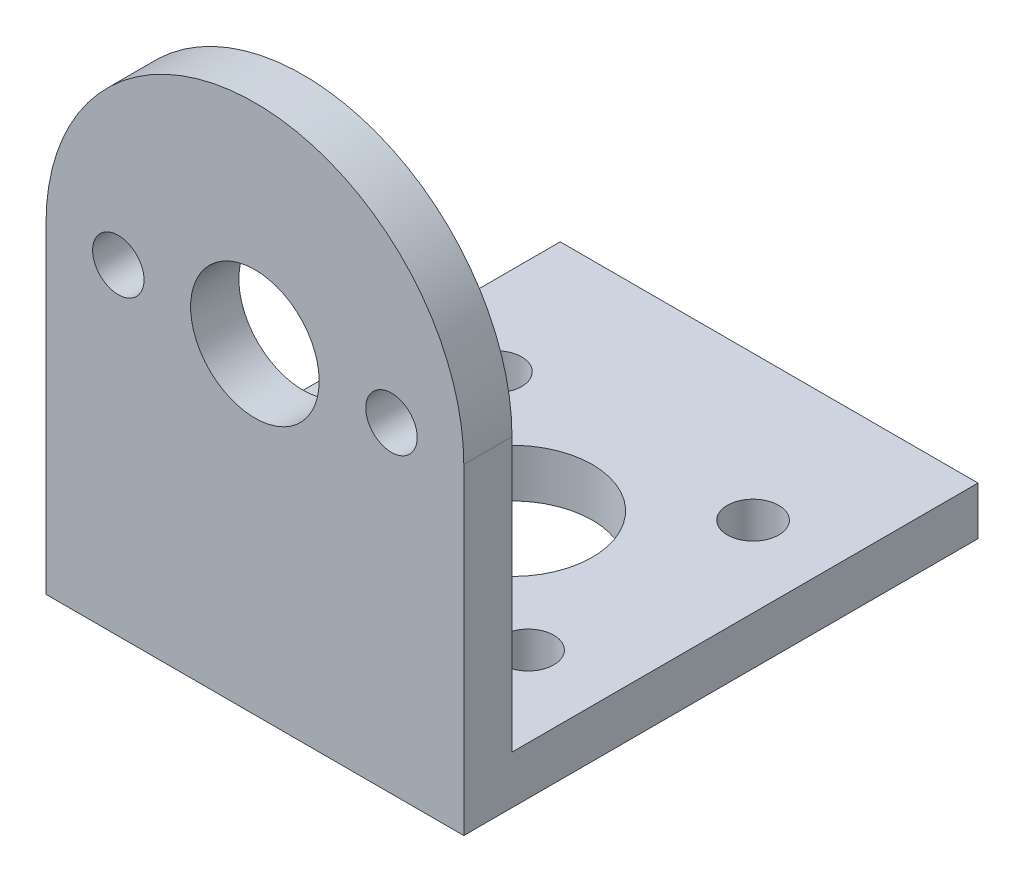
ISO-10303-21;
HEADER;
FILE_DESCRIPTION(('STEP AP214'),'2;1');
FILE_NAME('part.step','',(''),(''),'','','');
FILE_SCHEMA(('AUTOMOTIVE_DESIGN { 1 0 10303 214 1 1 1 1 }'));
ENDSEC;
DATA;
#1=APPLICATION_CONTEXT('core data for automotive mechanical design processes');
#2=APPLICATION_PROTOCOL_DEFINITION('international standard','automotive_design',2000,#1);
#3=PRODUCT_CONTEXT('',#1,'mechanical');
#4=PRODUCT('Part','Part','',(#3));
#5=PRODUCT_RELATED_PRODUCT_CATEGORY('part','',(#4));
#6=PRODUCT_DEFINITION_FORMATION('','',#4);
#7=PRODUCT_DEFINITION_CONTEXT('part definition',#1,'design');
#8=PRODUCT_DEFINITION('design','',#6,#7);
#9=PRODUCT_DEFINITION_SHAPE('','',#8);
#10=(LENGTH_UNIT() NAMED_UNIT(*) SI_UNIT(.MILLI.,.METRE.));
#11=(NAMED_UNIT(*) PLANE_ANGLE_UNIT() SI_UNIT($,.RADIAN.));
#12=(NAMED_UNIT(*) SI_UNIT($,.STERADIAN.) SOLID_ANGLE_UNIT());
#13=UNCERTAINTY_MEASURE_WITH_UNIT(LENGTH_MEASURE(1.E-05),#10,'distance_accuracy_value','');
#14=(GEOMETRIC_REPRESENTATION_CONTEXT(3) GLOBAL_UNCERTAINTY_ASSIGNED_CONTEXT((#13)) GLOBAL_UNIT_ASSIGNED_CONTEXT((#10,
#11,#12)) REPRESENTATION_CONTEXT('',''));
#15=CARTESIAN_POINT('',(0.,0.,0.));
#16=DIRECTION('',(0.,0.,1.));
#17=DIRECTION('',(1.,0.,0.));
#18=AXIS2_PLACEMENT_3D('',#15,#16,#17);
#19=CARTESIAN_POINT('',(0.,-20.,3.));
#20=DIRECTION('',(0.,1.,0.));
#21=DIRECTION('',(0.,0.,1.));
#22=AXIS2_PLACEMENT_3D('',#19,#20,#21);
#23=PLANE('',#22);
#24=CARTESIAN_POINT('',(13.,-20.,-13.));
#25=DIRECTION('',(0.,-1.,0.));
#26=DIRECTION('',(0.,0.,-1.));
#27=AXIS2_PLACEMENT_3D('',#24,#25,#26);
#28=CIRCLE('',#27,5.);
#29=CARTESIAN_POINT('',(13.,-20.,-18.));
#30=VERTEX_POINT('',#29);
#31=EDGE_CURVE('E264',#30,#30,#28,.T.);
#32=ORIENTED_EDGE('',*,*,#31,.F.);
#33=EDGE_LOOP('',(#32));
#34=FACE_BOUND('',#33,.T.);
#35=DIRECTION('',(0.,0.,-1.));
#36=VECTOR('',#35,1.);
#37=CARTESIAN_POINT('',(0.,-20.,3.));
#38=LINE('',#37,#36);
#39=CARTESIAN_POINT('',(0.,-20.,3.));
#40=VERTEX_POINT('',#39);
#41=CARTESIAN_POINT('',(0.,-20.,-29.));
#42=VERTEX_POINT('',#41);
#43=EDGE_CURVE('E109',#40,#42,#38,.T.);
#44=ORIENTED_EDGE('',*,*,#43,.T.);
#45=DIRECTION('',(-1.,0.,0.));
#46=VECTOR('',#45,1.);
#47=CARTESIAN_POINT('',(26.,-20.,-29.));
#48=LINE('',#47,#46);
#49=CARTESIAN_POINT('',(26.,-20.,-29.));
#50=VERTEX_POINT('',#49);
#51=EDGE_CURVE('E113',#50,#42,#48,.T.);
#52=ORIENTED_EDGE('',*,*,#51,.F.);
#53=DIRECTION('',(0.,0.,-1.));
#54=VECTOR('',#53,1.);
#55=CARTESIAN_POINT('',(26.,-20.,3.));
#56=LINE('',#55,#54);
#57=CARTESIAN_POINT('',(26.,-20.,3.));
#58=VERTEX_POINT('',#57);
#59=EDGE_CURVE('E102',#58,#50,#56,.T.);
#60=ORIENTED_EDGE('',*,*,#59,.F.);
#61=DIRECTION('',(1.,0.,0.));
#62=VECTOR('',#61,1.);
#63=CARTESIAN_POINT('',(0.,-20.,3.));
#64=LINE('',#63,#62);
#65=EDGE_CURVE('E86',#40,#58,#64,.T.);
#66=ORIENTED_EDGE('',*,*,#65,.F.);
#67=EDGE_LOOP('',(#44,#52,#60,#66));
#68=FACE_BOUND('',#67,.T.);
#69=CARTESIAN_POINT('',(5.,-20.,-20.));
#70=DIRECTION('',(0.,-1.,0.));
#71=DIRECTION('',(0.,0.,-1.));
#72=AXIS2_PLACEMENT_3D('',#69,#70,#71);
#73=CIRCLE('',#72,1.6);
#74=CARTESIAN_POINT('',(5.,-20.,-21.6));
#75=VERTEX_POINT('',#74);
#76=EDGE_CURVE('E127',#75,#75,#73,.F.);
#77=ORIENTED_EDGE('',*,*,#76,.T.);
#78=EDGE_LOOP('',(#77));
#79=FACE_BOUND('',#78,.T.);
#80=CARTESIAN_POINT('',(21.,-20.,-6.));
#81=DIRECTION('',(0.,-1.,0.));
#82=DIRECTION('',(0.,0.,-1.));
#83=AXIS2_PLACEMENT_3D('',#80,#81,#82);
#84=CIRCLE('',#83,1.6);
#85=CARTESIAN_POINT('',(21.,-20.,-7.60000000000001));
#86=VERTEX_POINT('',#85);
#87=EDGE_CURVE('E263',#86,#86,#84,.F.);
#88=ORIENTED_EDGE('',*,*,#87,.T.);
#89=EDGE_LOOP('',(#88));
#90=FACE_BOUND('',#89,.T.);
#91=CARTESIAN_POINT('',(21.,-20.,-20.));
#92=DIRECTION('',(0.,-1.,0.));
#93=DIRECTION('',(0.,0.,-1.));
#94=AXIS2_PLACEMENT_3D('',#91,#92,#93);
#95=CIRCLE('',#94,1.59999999999999);
#96=CARTESIAN_POINT('',(21.,-20.,-21.6));
#97=VERTEX_POINT('',#96);
#98=EDGE_CURVE('E261',#97,#97,#95,.T.);
#99=ORIENTED_EDGE('',*,*,#98,.F.);
#100=EDGE_LOOP('',(#99));
#101=FACE_BOUND('',#100,.T.);
#102=CARTESIAN_POINT('',(5.,-20.,-6.));
#103=DIRECTION('',(0.,-1.,0.));
#104=DIRECTION('',(0.,0.,-1.));
#105=AXIS2_PLACEMENT_3D('',#102,#103,#104);
#106=CIRCLE('',#105,1.6);
#107=CARTESIAN_POINT('',(5.,-20.,-7.6));
#108=VERTEX_POINT('',#107);
#109=EDGE_CURVE('E269',#108,#108,#106,.T.);
#110=ORIENTED_EDGE('',*,*,#109,.F.);
#111=EDGE_LOOP('',(#110));
#112=FACE_BOUND('',#111,.T.);
#113=ADVANCED_FACE('F42',(#34,#68,#79,#90,#101,#112),#23,.F.);
#114=CARTESIAN_POINT('',(26.,-17.,-29.));
#115=DIRECTION('',(0.,-1.,0.));
#116=DIRECTION('',(0.,0.,-1.));
#117=AXIS2_PLACEMENT_3D('',#114,#115,#116);
#118=PLANE('',#117);
#119=CARTESIAN_POINT('',(13.,-17.,-13.));
#120=DIRECTION('',(0.,-1.,0.));
#121=DIRECTION('',(0.,0.,-1.));
#122=AXIS2_PLACEMENT_3D('',#119,#120,#121);
#123=CIRCLE('',#122,5.);
#124=CARTESIAN_POINT('',(13.,-17.,-18.));
#125=VERTEX_POINT('',#124);
#126=EDGE_CURVE('E177',#125,#125,#123,.T.);
#127=ORIENTED_EDGE('',*,*,#126,.T.);
#128=EDGE_LOOP('',(#127));
#129=FACE_BOUND('',#128,.T.);
#130=DIRECTION('',(1.,0.,0.));
#131=VECTOR('',#130,1.);
#132=CARTESIAN_POINT('',(26.,-17.,0.));
#133=LINE('',#132,#131);
#134=CARTESIAN_POINT('',(0.,-17.,0.));
#135=VERTEX_POINT('',#134);
#136=CARTESIAN_POINT('',(26.,-17.,0.));
#137=VERTEX_POINT('',#136);
#138=EDGE_CURVE('E59',#135,#137,#133,.T.);
#139=ORIENTED_EDGE('',*,*,#138,.T.);
#140=DIRECTION('',(0.,0.,1.));
#141=VECTOR('',#140,1.);
#142=CARTESIAN_POINT('',(26.,-17.,-29.));
#143=LINE('',#142,#141);
#144=CARTESIAN_POINT('',(26.,-17.,-29.));
#145=VERTEX_POINT('',#144);
#146=EDGE_CURVE('E131',#145,#137,#143,.T.);
#147=ORIENTED_EDGE('',*,*,#146,.F.);
#148=DIRECTION('',(1.,0.,0.));
#149=VECTOR('',#148,1.);
#150=CARTESIAN_POINT('',(26.,-17.,-29.));
#151=LINE('',#150,#149);
#152=CARTESIAN_POINT('',(0.,-17.,-29.));
#153=VERTEX_POINT('',#152);
#154=EDGE_CURVE('E122',#153,#145,#151,.T.);
#155=ORIENTED_EDGE('',*,*,#154,.F.);
#156=DIRECTION('',(0.,0.,1.));
#157=VECTOR('',#156,1.);
#158=CARTESIAN_POINT('',(0.,-17.,-29.));
#159=LINE('',#158,#157);
#160=EDGE_CURVE('E134',#153,#135,#159,.T.);
#161=ORIENTED_EDGE('',*,*,#160,.T.);
#162=EDGE_LOOP('',(#139,#147,#155,#161));
#163=FACE_BOUND('',#162,.T.);
#164=CARTESIAN_POINT('',(5.,-17.,-20.));
#165=DIRECTION('',(0.,-1.,0.));
#166=DIRECTION('',(0.,0.,-1.));
#167=AXIS2_PLACEMENT_3D('',#164,#165,#166);
#168=CIRCLE('',#167,1.6);
#169=CARTESIAN_POINT('',(5.,-17.,-21.6));
#170=VERTEX_POINT('',#169);
#171=EDGE_CURVE('E169',#170,#170,#168,.F.);
#172=ORIENTED_EDGE('',*,*,#171,.F.);
#173=EDGE_LOOP('',(#172));
#174=FACE_BOUND('',#173,.T.);
#175=CARTESIAN_POINT('',(21.,-17.,-6.));
#176=DIRECTION('',(0.,-1.,0.));
#177=DIRECTION('',(0.,0.,-1.));
#178=AXIS2_PLACEMENT_3D('',#175,#176,#177);
#179=CIRCLE('',#178,1.6);
#180=CARTESIAN_POINT('',(21.,-17.,-7.60000000000001));
#181=VERTEX_POINT('',#180);
#182=EDGE_CURVE('E172',#181,#181,#179,.F.);
#183=ORIENTED_EDGE('',*,*,#182,.F.);
#184=EDGE_LOOP('',(#183));
#185=FACE_BOUND('',#184,.T.);
#186=CARTESIAN_POINT('',(21.,-17.,-20.));
#187=DIRECTION('',(0.,-1.,0.));
#188=DIRECTION('',(0.,0.,-1.));
#189=AXIS2_PLACEMENT_3D('',#186,#187,#188);
#190=CIRCLE('',#189,1.59999999999999);
#191=CARTESIAN_POINT('',(21.,-17.,-21.6));
#192=VERTEX_POINT('',#191);
#193=EDGE_CURVE('E175',#192,#192,#190,.T.);
#194=ORIENTED_EDGE('',*,*,#193,.T.);
#195=EDGE_LOOP('',(#194));
#196=FACE_BOUND('',#195,.T.);
#197=CARTESIAN_POINT('',(5.,-17.,-6.));
#198=DIRECTION('',(0.,-1.,0.));
#199=DIRECTION('',(0.,0.,-1.));
#200=AXIS2_PLACEMENT_3D('',#197,#198,#199);
#201=CIRCLE('',#200,1.6);
#202=CARTESIAN_POINT('',(5.,-17.,-7.6));
#203=VERTEX_POINT('',#202);
#204=EDGE_CURVE('E46',#203,#203,#201,.T.);
#205=ORIENTED_EDGE('',*,*,#204,.T.);
#206=EDGE_LOOP('',(#205));
#207=FACE_BOUND('',#206,.T.);
#208=ADVANCED_FACE('F184',(#129,#163,#174,#185,#196,#207),#118,.F.);
#209=CARTESIAN_POINT('',(13.,0.,0.));
#210=DIRECTION('',(0.,0.,1.));
#211=DIRECTION('',(1.,0.,0.));
#212=AXIS2_PLACEMENT_3D('',#209,#210,#211);
#213=PLANE('',#212);
#214=CARTESIAN_POINT('',(13.,0.,0.));
#215=DIRECTION('',(0.,0.,1.));
#216=DIRECTION('',(1.,0.,0.));
#217=AXIS2_PLACEMENT_3D('',#214,#215,#216);
#218=CIRCLE('',#217,4.);
#219=CARTESIAN_POINT('',(17.,0.,0.));
#220=VERTEX_POINT('',#219);
#221=EDGE_CURVE('E141',#220,#220,#218,.T.);
#222=ORIENTED_EDGE('',*,*,#221,.T.);
#223=EDGE_LOOP('',(#222));
#224=FACE_BOUND('',#223,.T.);
#225=CARTESIAN_POINT('',(21.5,0.,0.));
#226=DIRECTION('',(0.,0.,1.));
#227=DIRECTION('',(1.,0.,0.));
#228=AXIS2_PLACEMENT_3D('',#225,#226,#227);
#229=CIRCLE('',#228,1.6);
#230=CARTESIAN_POINT('',(23.1,0.,0.));
#231=VERTEX_POINT('',#230);
#232=EDGE_CURVE('E164',#231,#231,#229,.T.);
#233=ORIENTED_EDGE('',*,*,#232,.T.);
#234=EDGE_LOOP('',(#233));
#235=FACE_BOUND('',#234,.T.);
#236=CARTESIAN_POINT('',(4.49999999999999,0.,0.));
#237=DIRECTION('',(0.,0.,1.));
#238=DIRECTION('',(1.,0.,0.));
#239=AXIS2_PLACEMENT_3D('',#236,#237,#238);
#240=CIRCLE('',#239,1.6);
#241=CARTESIAN_POINT('',(6.09999999999999,0.,0.));
#242=VERTEX_POINT('',#241);
#243=EDGE_CURVE('E156',#242,#242,#240,.T.);
#244=ORIENTED_EDGE('',*,*,#243,.T.);
#245=EDGE_LOOP('',(#244));
#246=FACE_BOUND('',#245,.T.);
#247=ORIENTED_EDGE('',*,*,#138,.F.);
#248=DIRECTION('',(0.,-1.,0.));
#249=VECTOR('',#248,1.);
#250=CARTESIAN_POINT('',(0.,0.,0.));
#251=LINE('',#250,#249);
#252=CARTESIAN_POINT('',(0.,0.,0.));
#253=VERTEX_POINT('',#252);
#254=EDGE_CURVE('E155',#253,#135,#251,.T.);
#255=ORIENTED_EDGE('',*,*,#254,.F.);
#256=CARTESIAN_POINT('',(13.,0.,0.));
#257=DIRECTION('',(0.,0.,1.));
#258=DIRECTION('',(1.,0.,0.));
#259=AXIS2_PLACEMENT_3D('',#256,#257,#258);
#260=CIRCLE('',#259,13.);
#261=CARTESIAN_POINT('',(26.,0.,0.));
#262=VERTEX_POINT('',#261);
#263=EDGE_CURVE('E148',#262,#253,#260,.T.);
#264=ORIENTED_EDGE('',*,*,#263,.F.);
#265=DIRECTION('',(0.,-1.,0.));
#266=VECTOR('',#265,1.);
#267=CARTESIAN_POINT('',(26.,0.,0.));
#268=LINE('',#267,#266);
#269=EDGE_CURVE('E153',#262,#137,#268,.T.);
#270=ORIENTED_EDGE('',*,*,#269,.T.);
#271=EDGE_LOOP('',(#247,#255,#264,#270));
#272=FACE_BOUND('',#271,.T.);
#273=ADVANCED_FACE('F205',(#224,#235,#246,#272),#213,.F.);
#274=CARTESIAN_POINT('',(26.,0.,3.));
#275=DIRECTION('',(1.,0.,0.));
#276=DIRECTION('',(0.,0.,-1.));
#277=AXIS2_PLACEMENT_3D('',#274,#275,#276);
#278=PLANE('',#277);
#279=ORIENTED_EDGE('',*,*,#269,.F.);
#280=DIRECTION('',(0.,0.,-1.));
#281=VECTOR('',#280,1.);
#282=CARTESIAN_POINT('',(26.,0.,3.));
#283=LINE('',#282,#281);
#284=CARTESIAN_POINT('',(26.,0.,3.));
#285=VERTEX_POINT('',#284);
#286=EDGE_CURVE('E11',#285,#262,#283,.T.);
#287=ORIENTED_EDGE('',*,*,#286,.F.);
#288=DIRECTION('',(0.,-1.,0.));
#289=VECTOR('',#288,1.);
#290=CARTESIAN_POINT('',(26.,0.,3.));
#291=LINE('',#290,#289);
#292=EDGE_CURVE('E107',#285,#58,#291,.T.);
#293=ORIENTED_EDGE('',*,*,#292,.T.);
#294=ORIENTED_EDGE('',*,*,#59,.T.);
#295=DIRECTION('',(0.,-1.,0.));
#296=VECTOR('',#295,1.);
#297=CARTESIAN_POINT('',(26.,-20.,-29.));
#298=LINE('',#297,#296);
#299=EDGE_CURVE('E106',#145,#50,#298,.T.);
#300=ORIENTED_EDGE('',*,*,#299,.F.);
#301=ORIENTED_EDGE('',*,*,#146,.T.);
#302=EDGE_LOOP('',(#279,#287,#293,#294,#300,#301));
#303=FACE_BOUND('',#302,.T.);
#304=ADVANCED_FACE('F44',(#303),#278,.T.);
#305=CARTESIAN_POINT('',(13.,0.,3.));
#306=DIRECTION('',(0.,0.,-1.));
#307=DIRECTION('',(-1.,0.,0.));
#308=AXIS2_PLACEMENT_3D('',#305,#306,#307);
#309=CYLINDRICAL_SURFACE('',#308,13.);
#310=ORIENTED_EDGE('',*,*,#263,.T.);
#311=DIRECTION('',(0.,0.,-1.));
#312=VECTOR('',#311,1.);
#313=CARTESIAN_POINT('',(0.,0.,3.));
#314=LINE('',#313,#312);
#315=CARTESIAN_POINT('',(0.,0.,3.));
#316=VERTEX_POINT('',#315);
#317=EDGE_CURVE('E51',#316,#253,#314,.T.);
#318=ORIENTED_EDGE('',*,*,#317,.F.);
#319=CARTESIAN_POINT('',(13.,0.,3.));
#320=DIRECTION('',(0.,0.,1.));
#321=DIRECTION('',(1.,0.,0.));
#322=AXIS2_PLACEMENT_3D('',#319,#320,#321);
#323=CIRCLE('',#322,13.);
#324=EDGE_CURVE('E110',#285,#316,#323,.T.);
#325=ORIENTED_EDGE('',*,*,#324,.F.);
#326=ORIENTED_EDGE('',*,*,#286,.T.);
#327=EDGE_LOOP('',(#310,#318,#325,#326));
#328=FACE_BOUND('',#327,.T.);
#329=ADVANCED_FACE('F213',(#328),#309,.T.);
#330=CARTESIAN_POINT('',(0.,0.,3.));
#331=DIRECTION('',(1.,0.,0.));
#332=DIRECTION('',(0.,0.,-1.));
#333=AXIS2_PLACEMENT_3D('',#330,#331,#332);
#334=PLANE('',#333);
#335=ORIENTED_EDGE('',*,*,#254,.T.);
#336=ORIENTED_EDGE('',*,*,#160,.F.);
#337=DIRECTION('',(0.,1.,0.));
#338=VECTOR('',#337,1.);
#339=CARTESIAN_POINT('',(0.,-20.,-29.));
#340=LINE('',#339,#338);
#341=EDGE_CURVE('E118',#42,#153,#340,.T.);
#342=ORIENTED_EDGE('',*,*,#341,.F.);
#343=ORIENTED_EDGE('',*,*,#43,.F.);
#344=DIRECTION('',(0.,-1.,0.));
#345=VECTOR('',#344,1.);
#346=CARTESIAN_POINT('',(0.,0.,3.));
#347=LINE('',#346,#345);
#348=EDGE_CURVE('E150',#316,#40,#347,.T.);
#349=ORIENTED_EDGE('',*,*,#348,.F.);
#350=ORIENTED_EDGE('',*,*,#317,.T.);
#351=EDGE_LOOP('',(#335,#336,#342,#343,#349,#350));
#352=FACE_BOUND('',#351,.T.);
#353=ADVANCED_FACE('F209',(#352),#334,.F.);
#354=CARTESIAN_POINT('',(13.,0.,3.));
#355=DIRECTION('',(0.,0.,1.));
#356=DIRECTION('',(1.,0.,0.));
#357=AXIS2_PLACEMENT_3D('',#354,#355,#356);
#358=PLANE('',#357);
#359=CARTESIAN_POINT('',(4.49999999999999,0.,3.));
#360=DIRECTION('',(0.,0.,1.));
#361=DIRECTION('',(1.,0.,0.));
#362=AXIS2_PLACEMENT_3D('',#359,#360,#361);
#363=CIRCLE('',#362,1.6);
#364=CARTESIAN_POINT('',(6.09999999999999,0.,3.));
#365=VERTEX_POINT('',#364);
#366=EDGE_CURVE('E138',#365,#365,#363,.T.);
#367=ORIENTED_EDGE('',*,*,#366,.F.);
#368=EDGE_LOOP('',(#367));
#369=FACE_BOUND('',#368,.T.);
#370=CARTESIAN_POINT('',(21.5,0.,3.));
#371=DIRECTION('',(0.,0.,1.));
#372=DIRECTION('',(1.,0.,0.));
#373=AXIS2_PLACEMENT_3D('',#370,#371,#372);
#374=CIRCLE('',#373,1.6);
#375=CARTESIAN_POINT('',(23.1,0.,3.));
#376=VERTEX_POINT('',#375);
#377=EDGE_CURVE('E142',#376,#376,#374,.T.);
#378=ORIENTED_EDGE('',*,*,#377,.F.);
#379=EDGE_LOOP('',(#378));
#380=FACE_BOUND('',#379,.T.);
#381=CARTESIAN_POINT('',(13.,0.,3.));
#382=DIRECTION('',(0.,0.,1.));
#383=DIRECTION('',(1.,0.,0.));
#384=AXIS2_PLACEMENT_3D('',#381,#382,#383);
#385=CIRCLE('',#384,4.);
#386=CARTESIAN_POINT('',(17.,0.,3.));
#387=VERTEX_POINT('',#386);
#388=EDGE_CURVE('E137',#387,#387,#385,.T.);
#389=ORIENTED_EDGE('',*,*,#388,.F.);
#390=EDGE_LOOP('',(#389));
#391=FACE_BOUND('',#390,.T.);
#392=ORIENTED_EDGE('',*,*,#292,.F.);
#393=ORIENTED_EDGE('',*,*,#324,.T.);
#394=ORIENTED_EDGE('',*,*,#348,.T.);
#395=ORIENTED_EDGE('',*,*,#65,.T.);
#396=EDGE_LOOP('',(#392,#393,#394,#395));
#397=FACE_BOUND('',#396,.T.);
#398=ADVANCED_FACE('F212',(#369,#380,#391,#397),#358,.T.);
#399=CARTESIAN_POINT('',(13.,0.,-10.));
#400=DIRECTION('',(0.,0.,1.));
#401=DIRECTION('',(1.,0.,0.));
#402=AXIS2_PLACEMENT_3D('',#399,#400,#401);
#403=CYLINDRICAL_SURFACE('',#402,4.);
#404=ORIENTED_EDGE('',*,*,#388,.T.);
#405=EDGE_LOOP('',(#404));
#406=FACE_BOUND('',#405,.T.);
#407=ORIENTED_EDGE('',*,*,#221,.F.);
#408=EDGE_LOOP('',(#407));
#409=FACE_BOUND('',#408,.T.);
#410=ADVANCED_FACE('F222',(#406,#409),#403,.F.);
#411=CARTESIAN_POINT('',(21.5,0.,-10.));
#412=DIRECTION('',(0.,0.,1.));
#413=DIRECTION('',(1.,0.,0.));
#414=AXIS2_PLACEMENT_3D('',#411,#412,#413);
#415=CYLINDRICAL_SURFACE('',#414,1.6);
#416=ORIENTED_EDGE('',*,*,#377,.T.);
#417=EDGE_LOOP('',(#416));
#418=FACE_BOUND('',#417,.T.);
#419=ORIENTED_EDGE('',*,*,#232,.F.);
#420=EDGE_LOOP('',(#419));
#421=FACE_BOUND('',#420,.T.);
#422=ADVANCED_FACE('F226',(#418,#421),#415,.F.);
#423=CARTESIAN_POINT('',(4.49999999999999,0.,-10.));
#424=DIRECTION('',(0.,0.,1.));
#425=DIRECTION('',(1.,0.,0.));
#426=AXIS2_PLACEMENT_3D('',#423,#424,#425);
#427=CYLINDRICAL_SURFACE('',#426,1.6);
#428=ORIENTED_EDGE('',*,*,#366,.T.);
#429=EDGE_LOOP('',(#428));
#430=FACE_BOUND('',#429,.T.);
#431=ORIENTED_EDGE('',*,*,#243,.F.);
#432=EDGE_LOOP('',(#431));
#433=FACE_BOUND('',#432,.T.);
#434=ADVANCED_FACE('F230',(#430,#433),#427,.F.);
#435=CARTESIAN_POINT('',(0.,0.,-29.));
#436=DIRECTION('',(0.,0.,1.));
#437=DIRECTION('',(1.,0.,0.));
#438=AXIS2_PLACEMENT_3D('',#435,#436,#437);
#439=PLANE('',#438);
#440=ORIENTED_EDGE('',*,*,#299,.T.);
#441=ORIENTED_EDGE('',*,*,#51,.T.);
#442=ORIENTED_EDGE('',*,*,#341,.T.);
#443=ORIENTED_EDGE('',*,*,#154,.T.);
#444=EDGE_LOOP('',(#440,#441,#442,#443));
#445=FACE_BOUND('',#444,.T.);
#446=ADVANCED_FACE('F120',(#445),#439,.F.);
#447=CARTESIAN_POINT('',(5.,-10.,-20.));
#448=DIRECTION('',(0.,-1.,0.));
#449=DIRECTION('',(0.,0.,-1.));
#450=AXIS2_PLACEMENT_3D('',#447,#448,#449);
#451=CYLINDRICAL_SURFACE('',#450,1.6);
#452=ORIENTED_EDGE('',*,*,#76,.F.);
#453=EDGE_LOOP('',(#452));
#454=FACE_BOUND('',#453,.T.);
#455=ORIENTED_EDGE('',*,*,#171,.T.);
#456=EDGE_LOOP('',(#455));
#457=FACE_BOUND('',#456,.T.);
#458=ADVANCED_FACE('F235',(#454,#457),#451,.F.);
#459=CARTESIAN_POINT('',(21.,-10.,-6.));
#460=DIRECTION('',(0.,-1.,0.));
#461=DIRECTION('',(0.,0.,-1.));
#462=AXIS2_PLACEMENT_3D('',#459,#460,#461);
#463=CYLINDRICAL_SURFACE('',#462,1.6);
#464=ORIENTED_EDGE('',*,*,#87,.F.);
#465=EDGE_LOOP('',(#464));
#466=FACE_BOUND('',#465,.T.);
#467=ORIENTED_EDGE('',*,*,#182,.T.);
#468=EDGE_LOOP('',(#467));
#469=FACE_BOUND('',#468,.T.);
#470=ADVANCED_FACE('F237',(#466,#469),#463,.F.);
#471=CARTESIAN_POINT('',(21.,-10.,-20.));
#472=DIRECTION('',(0.,-1.,0.));
#473=DIRECTION('',(0.,0.,-1.));
#474=AXIS2_PLACEMENT_3D('',#471,#472,#473);
#475=CYLINDRICAL_SURFACE('',#474,1.59999999999999);
#476=ORIENTED_EDGE('',*,*,#98,.T.);
#477=EDGE_LOOP('',(#476));
#478=FACE_BOUND('',#477,.T.);
#479=ORIENTED_EDGE('',*,*,#193,.F.);
#480=EDGE_LOOP('',(#479));
#481=FACE_BOUND('',#480,.T.);
#482=ADVANCED_FACE('F194',(#478,#481),#475,.F.);
#483=CARTESIAN_POINT('',(13.,-10.,-13.));
#484=DIRECTION('',(0.,-1.,0.));
#485=DIRECTION('',(0.,0.,-1.));
#486=AXIS2_PLACEMENT_3D('',#483,#484,#485);
#487=CYLINDRICAL_SURFACE('',#486,5.);
#488=ORIENTED_EDGE('',*,*,#31,.T.);
#489=EDGE_LOOP('',(#488));
#490=FACE_BOUND('',#489,.T.);
#491=ORIENTED_EDGE('',*,*,#126,.F.);
#492=EDGE_LOOP('',(#491));
#493=FACE_BOUND('',#492,.T.);
#494=ADVANCED_FACE('F188',(#490,#493),#487,.F.);
#495=CARTESIAN_POINT('',(5.,-10.,-6.));
#496=DIRECTION('',(0.,-1.,0.));
#497=DIRECTION('',(0.,0.,-1.));
#498=AXIS2_PLACEMENT_3D('',#495,#496,#497);
#499=CYLINDRICAL_SURFACE('',#498,1.6);
#500=ORIENTED_EDGE('',*,*,#109,.T.);
#501=EDGE_LOOP('',(#500));
#502=FACE_BOUND('',#501,.T.);
#503=ORIENTED_EDGE('',*,*,#204,.F.);
#504=EDGE_LOOP('',(#503));
#505=FACE_BOUND('',#504,.T.);
#506=ADVANCED_FACE('F186',(#502,#505),#499,.F.);
#507=CLOSED_SHELL('',(#113,#208,#273,#304,#329,#353,#398,#410,#422,#434,#446,#458,#470,#482,
#494,#506));
#508=MANIFOLD_SOLID_BREP('B2',#507);
#509=ADVANCED_BREP_SHAPE_REPRESENTATION('',(#18,#508),#14);
#510=SHAPE_DEFINITION_REPRESENTATION(#9,#509);
ENDSEC;
END-ISO-10303-21;
